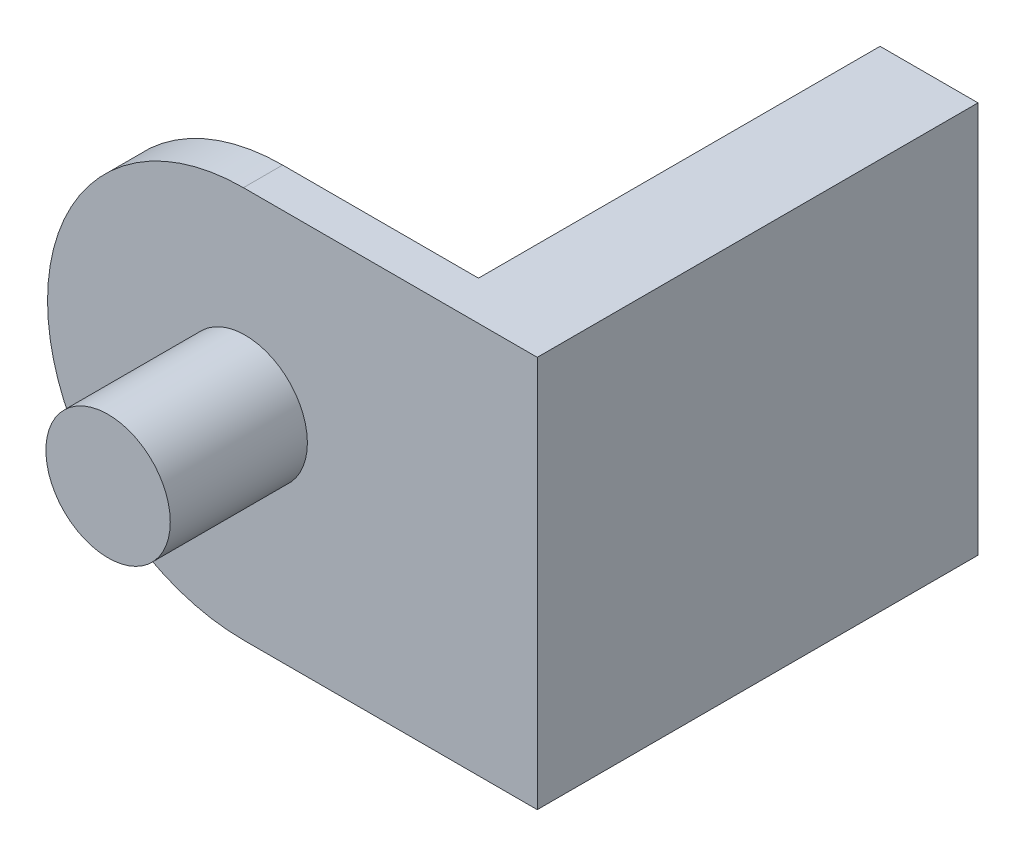
ISO-10303-21;
HEADER;
FILE_DESCRIPTION(('STEP AP214'),'2;1');
FILE_NAME('part.step','',(''),(''),'','','');
FILE_SCHEMA(('AUTOMOTIVE_DESIGN { 1 0 10303 214 1 1 1 1 }'));
ENDSEC;
DATA;
#1=APPLICATION_CONTEXT('core data for automotive mechanical design processes');
#2=APPLICATION_PROTOCOL_DEFINITION('international standard','automotive_design',2000,#1);
#3=PRODUCT_CONTEXT('',#1,'mechanical');
#4=PRODUCT('Part','Part','',(#3));
#5=PRODUCT_RELATED_PRODUCT_CATEGORY('part','',(#4));
#6=PRODUCT_DEFINITION_FORMATION('','',#4);
#7=PRODUCT_DEFINITION_CONTEXT('part definition',#1,'design');
#8=PRODUCT_DEFINITION('design','',#6,#7);
#9=PRODUCT_DEFINITION_SHAPE('','',#8);
#10=(LENGTH_UNIT() NAMED_UNIT(*) SI_UNIT(.MILLI.,.METRE.));
#11=(NAMED_UNIT(*) PLANE_ANGLE_UNIT() SI_UNIT($,.RADIAN.));
#12=(NAMED_UNIT(*) SI_UNIT($,.STERADIAN.) SOLID_ANGLE_UNIT());
#13=UNCERTAINTY_MEASURE_WITH_UNIT(LENGTH_MEASURE(1.E-05),#10,'distance_accuracy_value','');
#14=(GEOMETRIC_REPRESENTATION_CONTEXT(3) GLOBAL_UNCERTAINTY_ASSIGNED_CONTEXT((#13)) GLOBAL_UNIT_ASSIGNED_CONTEXT((#10,
#11,#12)) REPRESENTATION_CONTEXT('',''));
#15=CARTESIAN_POINT('',(0.,0.,0.));
#16=DIRECTION('',(0.,0.,1.));
#17=DIRECTION('',(1.,0.,0.));
#18=AXIS2_PLACEMENT_3D('',#15,#16,#17);
#19=CARTESIAN_POINT('',(2.5,10.,20.5));
#20=DIRECTION('',(-1.,0.,0.));
#21=DIRECTION('',(0.,-1.,0.));
#22=AXIS2_PLACEMENT_3D('',#19,#20,#21);
#23=PLANE('',#22);
#24=DIRECTION('',(0.,1.,0.));
#25=VECTOR('',#24,1.);
#26=CARTESIAN_POINT('',(2.5,10.,0.));
#27=LINE('',#26,#25);
#28=CARTESIAN_POINT('',(2.5,-10.,0.));
#29=VERTEX_POINT('',#28);
#30=CARTESIAN_POINT('',(2.5,10.,0.));
#31=VERTEX_POINT('',#30);
#32=EDGE_CURVE('E96',#29,#31,#27,.T.);
#33=ORIENTED_EDGE('',*,*,#32,.T.);
#34=DIRECTION('',(0.,0.,-1.));
#35=VECTOR('',#34,1.);
#36=CARTESIAN_POINT('',(2.5,10.,20.5));
#37=LINE('',#36,#35);
#38=CARTESIAN_POINT('',(2.5,10.,22.5));
#39=VERTEX_POINT('',#38);
#40=EDGE_CURVE('E90',#39,#31,#37,.T.);
#41=ORIENTED_EDGE('',*,*,#40,.F.);
#42=DIRECTION('',(0.,1.,0.));
#43=VECTOR('',#42,1.);
#44=CARTESIAN_POINT('',(2.5,10.,22.5));
#45=LINE('',#44,#43);
#46=CARTESIAN_POINT('',(2.5,-10.,22.5));
#47=VERTEX_POINT('',#46);
#48=EDGE_CURVE('E94',#47,#39,#45,.T.);
#49=ORIENTED_EDGE('',*,*,#48,.F.);
#50=DIRECTION('',(0.,0.,-1.));
#51=VECTOR('',#50,1.);
#52=CARTESIAN_POINT('',(2.5,-10.,20.5));
#53=LINE('',#52,#51);
#54=EDGE_CURVE('E124',#47,#29,#53,.T.);
#55=ORIENTED_EDGE('',*,*,#54,.T.);
#56=EDGE_LOOP('',(#33,#41,#49,#55));
#57=FACE_BOUND('',#56,.T.);
#58=ADVANCED_FACE('F33',(#57),#23,.F.);
#59=CARTESIAN_POINT('',(-2.5,10.,20.5));
#60=DIRECTION('',(0.,-1.,0.));
#61=DIRECTION('',(0.,0.,-1.));
#62=AXIS2_PLACEMENT_3D('',#59,#60,#61);
#63=PLANE('',#62);
#64=DIRECTION('',(-1.,0.,0.));
#65=VECTOR('',#64,1.);
#66=CARTESIAN_POINT('',(2.5,10.,20.5));
#67=LINE('',#66,#65);
#68=CARTESIAN_POINT('',(-2.5,10.,20.5));
#69=VERTEX_POINT('',#68);
#70=CARTESIAN_POINT('',(-12.5,9.99999999999999,20.5));
#71=VERTEX_POINT('',#70);
#72=EDGE_CURVE('E113',#69,#71,#67,.T.);
#73=ORIENTED_EDGE('',*,*,#72,.T.);
#74=DIRECTION('',(0.,0.,-1.));
#75=VECTOR('',#74,1.);
#76=CARTESIAN_POINT('',(-12.5,10.,20.5));
#77=LINE('',#76,#75);
#78=CARTESIAN_POINT('',(-12.5,9.99999999999999,22.5));
#79=VERTEX_POINT('',#78);
#80=EDGE_CURVE('E106',#71,#79,#77,.F.);
#81=ORIENTED_EDGE('',*,*,#80,.T.);
#82=DIRECTION('',(-1.,0.,0.));
#83=VECTOR('',#82,1.);
#84=CARTESIAN_POINT('',(2.5,10.,22.5));
#85=LINE('',#84,#83);
#86=EDGE_CURVE('E102',#39,#79,#85,.T.);
#87=ORIENTED_EDGE('',*,*,#86,.F.);
#88=ORIENTED_EDGE('',*,*,#40,.T.);
#89=DIRECTION('',(-1.,0.,0.));
#90=VECTOR('',#89,1.);
#91=CARTESIAN_POINT('',(-2.5,10.,0.));
#92=LINE('',#91,#90);
#93=CARTESIAN_POINT('',(-2.5,10.,0.));
#94=VERTEX_POINT('',#93);
#95=EDGE_CURVE('E127',#31,#94,#92,.T.);
#96=ORIENTED_EDGE('',*,*,#95,.T.);
#97=DIRECTION('',(0.,0.,-1.));
#98=VECTOR('',#97,1.);
#99=CARTESIAN_POINT('',(-2.5,10.,20.5));
#100=LINE('',#99,#98);
#101=EDGE_CURVE('E99',#69,#94,#100,.T.);
#102=ORIENTED_EDGE('',*,*,#101,.F.);
#103=EDGE_LOOP('',(#73,#81,#87,#88,#96,#102));
#104=FACE_BOUND('',#103,.T.);
#105=ADVANCED_FACE('F104',(#104),#63,.F.);
#106=CARTESIAN_POINT('',(-2.5,10.,20.5));
#107=DIRECTION('',(1.,0.,0.));
#108=DIRECTION('',(0.,1.,0.));
#109=AXIS2_PLACEMENT_3D('',#106,#107,#108);
#110=PLANE('',#109);
#111=DIRECTION('',(0.,-1.,0.));
#112=VECTOR('',#111,1.);
#113=CARTESIAN_POINT('',(-2.5,10.,0.));
#114=LINE('',#113,#112);
#115=CARTESIAN_POINT('',(-2.5,-10.,0.));
#116=VERTEX_POINT('',#115);
#117=EDGE_CURVE('E129',#94,#116,#114,.T.);
#118=ORIENTED_EDGE('',*,*,#117,.T.);
#119=DIRECTION('',(0.,0.,-1.));
#120=VECTOR('',#119,1.);
#121=CARTESIAN_POINT('',(-2.5,-10.,20.5));
#122=LINE('',#121,#120);
#123=CARTESIAN_POINT('',(-2.5,-10.,20.5));
#124=VERTEX_POINT('',#123);
#125=EDGE_CURVE('E133',#124,#116,#122,.T.);
#126=ORIENTED_EDGE('',*,*,#125,.F.);
#127=DIRECTION('',(0.,-1.,0.));
#128=VECTOR('',#127,1.);
#129=CARTESIAN_POINT('',(-2.5,10.,20.5));
#130=LINE('',#129,#128);
#131=EDGE_CURVE('E121',#69,#124,#130,.T.);
#132=ORIENTED_EDGE('',*,*,#131,.F.);
#133=ORIENTED_EDGE('',*,*,#101,.T.);
#134=EDGE_LOOP('',(#118,#126,#132,#133));
#135=FACE_BOUND('',#134,.T.);
#136=ADVANCED_FACE('F184',(#135),#110,.F.);
#137=CARTESIAN_POINT('',(-2.5,-10.,20.5));
#138=DIRECTION('',(0.,1.,0.));
#139=DIRECTION('',(0.,0.,1.));
#140=AXIS2_PLACEMENT_3D('',#137,#138,#139);
#141=PLANE('',#140);
#142=DIRECTION('',(1.,0.,0.));
#143=VECTOR('',#142,1.);
#144=CARTESIAN_POINT('',(2.5,-10.,22.5));
#145=LINE('',#144,#143);
#146=CARTESIAN_POINT('',(-12.5,-10.,22.5));
#147=VERTEX_POINT('',#146);
#148=EDGE_CURVE('E107',#147,#47,#145,.T.);
#149=ORIENTED_EDGE('',*,*,#148,.F.);
#150=DIRECTION('',(0.,0.,-1.));
#151=VECTOR('',#150,1.);
#152=CARTESIAN_POINT('',(-12.5,-10.,20.5));
#153=LINE('',#152,#151);
#154=CARTESIAN_POINT('',(-12.5,-10.,20.5));
#155=VERTEX_POINT('',#154);
#156=EDGE_CURVE('E11',#147,#155,#153,.T.);
#157=ORIENTED_EDGE('',*,*,#156,.T.);
#158=DIRECTION('',(1.,0.,0.));
#159=VECTOR('',#158,1.);
#160=CARTESIAN_POINT('',(2.5,-10.,20.5));
#161=LINE('',#160,#159);
#162=EDGE_CURVE('E111',#155,#124,#161,.T.);
#163=ORIENTED_EDGE('',*,*,#162,.T.);
#164=ORIENTED_EDGE('',*,*,#125,.T.);
#165=DIRECTION('',(1.,0.,0.));
#166=VECTOR('',#165,1.);
#167=CARTESIAN_POINT('',(-2.5,-10.,0.));
#168=LINE('',#167,#166);
#169=EDGE_CURVE('E125',#116,#29,#168,.T.);
#170=ORIENTED_EDGE('',*,*,#169,.T.);
#171=ORIENTED_EDGE('',*,*,#54,.F.);
#172=EDGE_LOOP('',(#149,#157,#163,#164,#170,#171));
#173=FACE_BOUND('',#172,.T.);
#174=ADVANCED_FACE('F178',(#173),#141,.F.);
#175=CARTESIAN_POINT('',(0.,0.,0.));
#176=DIRECTION('',(0.,0.,1.));
#177=DIRECTION('',(1.,0.,0.));
#178=AXIS2_PLACEMENT_3D('',#175,#176,#177);
#179=PLANE('',#178);
#180=CARTESIAN_POINT('',(0.,5.,0.));
#181=DIRECTION('',(0.,0.,-1.));
#182=DIRECTION('',(-1.,0.,0.));
#183=AXIS2_PLACEMENT_3D('',#180,#181,#182);
#184=CIRCLE('',#183,1.05);
#185=CARTESIAN_POINT('',(-1.05,5.,0.));
#186=VERTEX_POINT('',#185);
#187=EDGE_CURVE('E159',#186,#186,#184,.T.);
#188=ORIENTED_EDGE('',*,*,#187,.F.);
#189=EDGE_LOOP('',(#188));
#190=FACE_BOUND('',#189,.T.);
#191=CARTESIAN_POINT('',(0.,-5.,0.));
#192=DIRECTION('',(0.,0.,-1.));
#193=DIRECTION('',(-1.,0.,0.));
#194=AXIS2_PLACEMENT_3D('',#191,#192,#193);
#195=CIRCLE('',#194,1.05);
#196=CARTESIAN_POINT('',(-1.05,-5.,0.));
#197=VERTEX_POINT('',#196);
#198=EDGE_CURVE('E169',#197,#197,#195,.T.);
#199=ORIENTED_EDGE('',*,*,#198,.F.);
#200=EDGE_LOOP('',(#199));
#201=FACE_BOUND('',#200,.T.);
#202=ORIENTED_EDGE('',*,*,#32,.F.);
#203=ORIENTED_EDGE('',*,*,#169,.F.);
#204=ORIENTED_EDGE('',*,*,#117,.F.);
#205=ORIENTED_EDGE('',*,*,#95,.F.);
#206=EDGE_LOOP('',(#202,#203,#204,#205));
#207=FACE_BOUND('',#206,.T.);
#208=ADVANCED_FACE('F175',(#190,#201,#207),#179,.F.);
#209=CARTESIAN_POINT('',(0.,0.,22.5));
#210=DIRECTION('',(0.,0.,-1.));
#211=DIRECTION('',(-1.,0.,0.));
#212=AXIS2_PLACEMENT_3D('',#209,#210,#211);
#213=PLANE('',#212);
#214=CARTESIAN_POINT('',(-12.41,0.349999999999998,22.5));
#215=DIRECTION('',(0.,0.,1.));
#216=DIRECTION('',(1.,0.,0.));
#217=AXIS2_PLACEMENT_3D('',#214,#215,#216);
#218=CIRCLE('',#217,3.175);
#219=CARTESIAN_POINT('',(-9.235,0.349999999999998,22.5));
#220=VERTEX_POINT('',#219);
#221=EDGE_CURVE('E98',#220,#220,#218,.T.);
#222=ORIENTED_EDGE('',*,*,#221,.F.);
#223=EDGE_LOOP('',(#222));
#224=FACE_BOUND('',#223,.T.);
#225=ORIENTED_EDGE('',*,*,#86,.T.);
#226=CARTESIAN_POINT('',(-12.5,0.,22.5));
#227=DIRECTION('',(0.,0.,-1.));
#228=DIRECTION('',(-1.,0.,0.));
#229=AXIS2_PLACEMENT_3D('',#226,#227,#228);
#230=CIRCLE('',#229,10.);
#231=CARTESIAN_POINT('',(-22.5,0.,22.5));
#232=VERTEX_POINT('',#231);
#233=EDGE_CURVE('E42',#79,#232,#230,.F.);
#234=ORIENTED_EDGE('',*,*,#233,.T.);
#235=CARTESIAN_POINT('',(-12.5,0.,22.5));
#236=DIRECTION('',(0.,0.,-1.));
#237=DIRECTION('',(-1.,0.,0.));
#238=AXIS2_PLACEMENT_3D('',#235,#236,#237);
#239=CIRCLE('',#238,10.);
#240=EDGE_CURVE('E49',#232,#147,#239,.F.);
#241=ORIENTED_EDGE('',*,*,#240,.T.);
#242=ORIENTED_EDGE('',*,*,#148,.T.);
#243=ORIENTED_EDGE('',*,*,#48,.T.);
#244=EDGE_LOOP('',(#225,#234,#241,#242,#243));
#245=FACE_BOUND('',#244,.T.);
#246=ADVANCED_FACE('F109',(#224,#245),#213,.F.);
#247=CARTESIAN_POINT('',(0.,0.,20.5));
#248=DIRECTION('',(0.,0.,-1.));
#249=DIRECTION('',(-1.,0.,0.));
#250=AXIS2_PLACEMENT_3D('',#247,#248,#249);
#251=PLANE('',#250);
#252=CARTESIAN_POINT('',(-12.5,0.,20.5));
#253=DIRECTION('',(0.,0.,-1.));
#254=DIRECTION('',(-1.,0.,0.));
#255=AXIS2_PLACEMENT_3D('',#252,#253,#254);
#256=CIRCLE('',#255,10.);
#257=CARTESIAN_POINT('',(-22.5,0.,20.5));
#258=VERTEX_POINT('',#257);
#259=EDGE_CURVE('E138',#155,#258,#256,.T.);
#260=ORIENTED_EDGE('',*,*,#259,.T.);
#261=CARTESIAN_POINT('',(-12.5,0.,20.5));
#262=DIRECTION('',(0.,0.,-1.));
#263=DIRECTION('',(-1.,0.,0.));
#264=AXIS2_PLACEMENT_3D('',#261,#262,#263);
#265=CIRCLE('',#264,10.);
#266=EDGE_CURVE('E140',#258,#71,#265,.T.);
#267=ORIENTED_EDGE('',*,*,#266,.T.);
#268=ORIENTED_EDGE('',*,*,#72,.F.);
#269=ORIENTED_EDGE('',*,*,#131,.T.);
#270=ORIENTED_EDGE('',*,*,#162,.F.);
#271=EDGE_LOOP('',(#260,#267,#268,#269,#270));
#272=FACE_BOUND('',#271,.T.);
#273=ADVANCED_FACE('F147',(#272),#251,.T.);
#274=CARTESIAN_POINT('',(-12.41,0.349999999999998,29.5));
#275=DIRECTION('',(0.,0.,-1.));
#276=DIRECTION('',(-1.,0.,0.));
#277=AXIS2_PLACEMENT_3D('',#274,#275,#276);
#278=CYLINDRICAL_SURFACE('',#277,3.175);
#279=CARTESIAN_POINT('',(-12.41,0.349999999999998,29.5));
#280=DIRECTION('',(0.,0.,1.));
#281=DIRECTION('',(1.,0.,0.));
#282=AXIS2_PLACEMENT_3D('',#279,#280,#281);
#283=CIRCLE('',#282,3.175);
#284=CARTESIAN_POINT('',(-9.235,0.349999999999998,29.5));
#285=VERTEX_POINT('',#284);
#286=EDGE_CURVE('E119',#285,#285,#283,.T.);
#287=ORIENTED_EDGE('',*,*,#286,.F.);
#288=EDGE_LOOP('',(#287));
#289=FACE_BOUND('',#288,.T.);
#290=ORIENTED_EDGE('',*,*,#221,.T.);
#291=EDGE_LOOP('',(#290));
#292=FACE_BOUND('',#291,.T.);
#293=ADVANCED_FACE('F213',(#289,#292),#278,.T.);
#294=CARTESIAN_POINT('',(-12.41,0.349999999999998,29.5));
#295=DIRECTION('',(0.,0.,1.));
#296=DIRECTION('',(1.,0.,0.));
#297=AXIS2_PLACEMENT_3D('',#294,#295,#296);
#298=PLANE('',#297);
#299=ORIENTED_EDGE('',*,*,#286,.T.);
#300=EDGE_LOOP('',(#299));
#301=FACE_BOUND('',#300,.T.);
#302=ADVANCED_FACE('F209',(#301),#298,.T.);
#303=CARTESIAN_POINT('',(-12.5,0.,20.5));
#304=DIRECTION('',(0.,0.,-1.));
#305=DIRECTION('',(-1.,0.,0.));
#306=AXIS2_PLACEMENT_3D('',#303,#304,#305);
#307=CYLINDRICAL_SURFACE('',#306,10.);
#308=ORIENTED_EDGE('',*,*,#156,.F.);
#309=ORIENTED_EDGE('',*,*,#240,.F.);
#310=DIRECTION('',(0.,0.,-1.));
#311=VECTOR('',#310,1.);
#312=CARTESIAN_POINT('',(-22.5,0.,22.5));
#313=LINE('',#312,#311);
#314=EDGE_CURVE('E37',#258,#232,#313,.F.);
#315=ORIENTED_EDGE('',*,*,#314,.F.);
#316=ORIENTED_EDGE('',*,*,#259,.F.);
#317=EDGE_LOOP('',(#308,#309,#315,#316));
#318=FACE_BOUND('',#317,.T.);
#319=ADVANCED_FACE('F35',(#318),#307,.T.);
#320=CARTESIAN_POINT('',(-12.5,0.,22.5));
#321=DIRECTION('',(0.,0.,-1.));
#322=DIRECTION('',(-1.,0.,0.));
#323=AXIS2_PLACEMENT_3D('',#320,#321,#322);
#324=CYLINDRICAL_SURFACE('',#323,10.);
#325=ORIENTED_EDGE('',*,*,#233,.F.);
#326=ORIENTED_EDGE('',*,*,#80,.F.);
#327=ORIENTED_EDGE('',*,*,#266,.F.);
#328=ORIENTED_EDGE('',*,*,#314,.T.);
#329=EDGE_LOOP('',(#325,#326,#327,#328));
#330=FACE_BOUND('',#329,.T.);
#331=ADVANCED_FACE('F154',(#330),#324,.T.);
#332=CARTESIAN_POINT('',(0.,-5.,8.));
#333=DIRECTION('',(0.,0.,-1.));
#334=DIRECTION('',(-1.,0.,0.));
#335=AXIS2_PLACEMENT_3D('',#332,#333,#334);
#336=CYLINDRICAL_SURFACE('',#335,1.05);
#337=CARTESIAN_POINT('',(0.,-5.,8.));
#338=DIRECTION('',(0.,0.,-1.));
#339=DIRECTION('',(-1.,0.,0.));
#340=AXIS2_PLACEMENT_3D('',#337,#338,#339);
#341=CIRCLE('',#340,1.05);
#342=CARTESIAN_POINT('',(-1.05,-5.,8.));
#343=VERTEX_POINT('',#342);
#344=EDGE_CURVE('E164',#343,#343,#341,.T.);
#345=ORIENTED_EDGE('',*,*,#344,.F.);
#346=EDGE_LOOP('',(#345));
#347=FACE_BOUND('',#346,.T.);
#348=ORIENTED_EDGE('',*,*,#198,.T.);
#349=EDGE_LOOP('',(#348));
#350=FACE_BOUND('',#349,.T.);
#351=ADVANCED_FACE('F173',(#347,#350),#336,.F.);
#352=CARTESIAN_POINT('',(0.,-5.,8.));
#353=DIRECTION('',(0.,0.,-1.));
#354=DIRECTION('',(-1.,0.,0.));
#355=AXIS2_PLACEMENT_3D('',#352,#353,#354);
#356=PLANE('',#355);
#357=ORIENTED_EDGE('',*,*,#344,.T.);
#358=EDGE_LOOP('',(#357));
#359=FACE_BOUND('',#358,.T.);
#360=ADVANCED_FACE('F206',(#359),#356,.T.);
#361=CARTESIAN_POINT('',(0.,5.,8.));
#362=DIRECTION('',(0.,0.,-1.));
#363=DIRECTION('',(-1.,0.,0.));
#364=AXIS2_PLACEMENT_3D('',#361,#362,#363);
#365=CYLINDRICAL_SURFACE('',#364,1.05);
#366=CARTESIAN_POINT('',(0.,5.,8.));
#367=DIRECTION('',(0.,0.,-1.));
#368=DIRECTION('',(-1.,0.,0.));
#369=AXIS2_PLACEMENT_3D('',#366,#367,#368);
#370=CIRCLE('',#369,1.05);
#371=CARTESIAN_POINT('',(-1.05,5.,8.));
#372=VERTEX_POINT('',#371);
#373=EDGE_CURVE('E156',#372,#372,#370,.T.);
#374=ORIENTED_EDGE('',*,*,#373,.F.);
#375=EDGE_LOOP('',(#374));
#376=FACE_BOUND('',#375,.T.);
#377=ORIENTED_EDGE('',*,*,#187,.T.);
#378=EDGE_LOOP('',(#377));
#379=FACE_BOUND('',#378,.T.);
#380=ADVANCED_FACE('F296',(#376,#379),#365,.F.);
#381=CARTESIAN_POINT('',(0.,5.,8.));
#382=DIRECTION('',(0.,0.,-1.));
#383=DIRECTION('',(-1.,0.,0.));
#384=AXIS2_PLACEMENT_3D('',#381,#382,#383);
#385=PLANE('',#384);
#386=ORIENTED_EDGE('',*,*,#373,.T.);
#387=EDGE_LOOP('',(#386));
#388=FACE_BOUND('',#387,.T.);
#389=ADVANCED_FACE('F305',(#388),#385,.T.);
#390=CLOSED_SHELL('',(#58,#105,#136,#174,#208,#246,#273,#293,#302,#319,#331,#351,#360,#380,#389));
#391=MANIFOLD_SOLID_BREP('B2',#390);
#392=ADVANCED_BREP_SHAPE_REPRESENTATION('',(#18,#391),#14);
#393=SHAPE_DEFINITION_REPRESENTATION(#9,#392);
ENDSEC;
END-ISO-10303-21;
